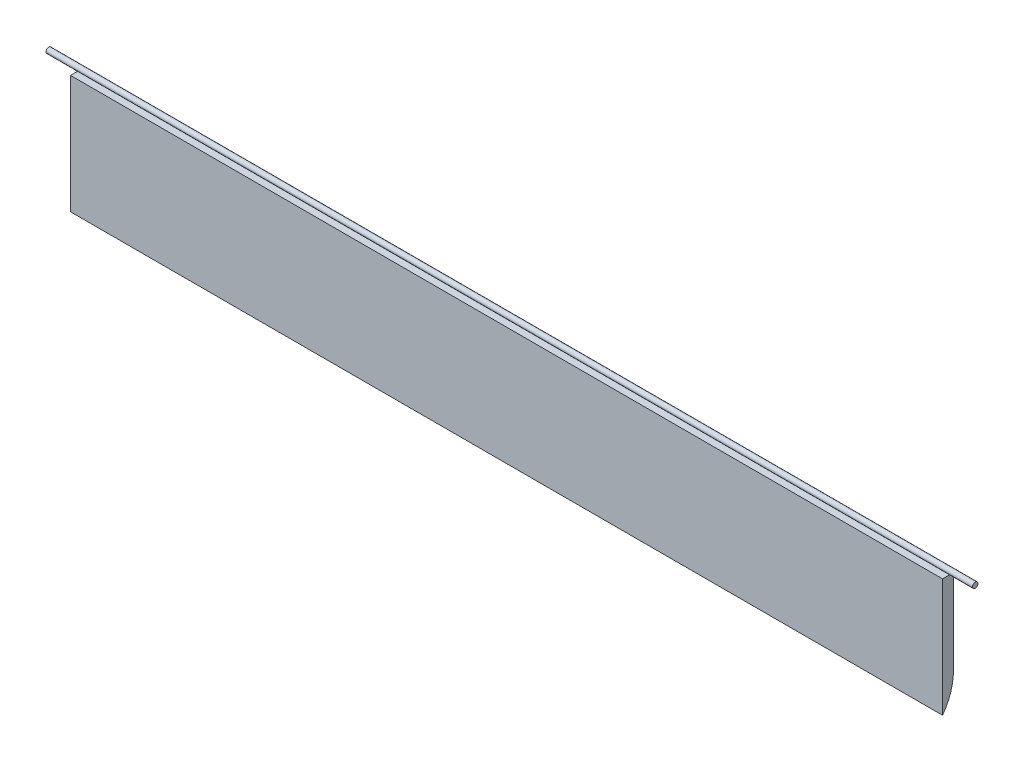
ISO-10303-21;
HEADER;
FILE_DESCRIPTION(('STEP AP214'),'2;1');
FILE_NAME('part.step','',(''),(''),'','','');
FILE_SCHEMA(('AUTOMOTIVE_DESIGN { 1 0 10303 214 1 1 1 1 }'));
ENDSEC;
DATA;
#1=APPLICATION_CONTEXT('core data for automotive mechanical design processes');
#2=APPLICATION_PROTOCOL_DEFINITION('international standard','automotive_design',2000,#1);
#3=PRODUCT_CONTEXT('',#1,'mechanical');
#4=PRODUCT('Part','Part','',(#3));
#5=PRODUCT_RELATED_PRODUCT_CATEGORY('part','',(#4));
#6=PRODUCT_DEFINITION_FORMATION('','',#4);
#7=PRODUCT_DEFINITION_CONTEXT('part definition',#1,'design');
#8=PRODUCT_DEFINITION('design','',#6,#7);
#9=PRODUCT_DEFINITION_SHAPE('','',#8);
#10=(LENGTH_UNIT() NAMED_UNIT(*) SI_UNIT(.MILLI.,.METRE.));
#11=(NAMED_UNIT(*) PLANE_ANGLE_UNIT() SI_UNIT($,.RADIAN.));
#12=(NAMED_UNIT(*) SI_UNIT($,.STERADIAN.) SOLID_ANGLE_UNIT());
#13=UNCERTAINTY_MEASURE_WITH_UNIT(LENGTH_MEASURE(1.E-05),#10,'distance_accuracy_value','');
#14=(GEOMETRIC_REPRESENTATION_CONTEXT(3) GLOBAL_UNCERTAINTY_ASSIGNED_CONTEXT((#13)) GLOBAL_UNIT_ASSIGNED_CONTEXT((#10,
#11,#12)) REPRESENTATION_CONTEXT('',''));
#15=CARTESIAN_POINT('',(0.,0.,0.));
#16=DIRECTION('',(0.,0.,1.));
#17=DIRECTION('',(1.,0.,0.));
#18=AXIS2_PLACEMENT_3D('',#15,#16,#17);
#19=CARTESIAN_POINT('',(40.,6.98,1.));
#20=DIRECTION('',(-1.,0.,0.));
#21=DIRECTION('',(0.,0.,1.));
#22=AXIS2_PLACEMENT_3D('',#19,#20,#21);
#23=PLANE('',#22);
#24=DIRECTION('',(0.,0.,-1.));
#25=VECTOR('',#24,1.);
#26=CARTESIAN_POINT('',(40.,5.98,1.));
#27=LINE('',#26,#25);
#28=CARTESIAN_POINT('',(40.,5.98,1.));
#29=VERTEX_POINT('',#28);
#30=CARTESIAN_POINT('',(40.,5.98,0.));
#31=VERTEX_POINT('',#30);
#32=EDGE_CURVE('E12',#29,#31,#27,.T.);
#33=ORIENTED_EDGE('',*,*,#32,.F.);
#34=DIRECTION('',(0.,1.,0.));
#35=VECTOR('',#34,1.);
#36=CARTESIAN_POINT('',(40.,6.98,1.));
#37=LINE('',#36,#35);
#38=CARTESIAN_POINT('',(40.,-4.85947216639639,1.));
#39=VERTEX_POINT('',#38);
#40=EDGE_CURVE('E135',#39,#29,#37,.T.);
#41=ORIENTED_EDGE('',*,*,#40,.F.);
#42=CARTESIAN_POINT('',(40.,-1.80008981549426,5.17991018450574));
#43=DIRECTION('',(-1.,0.,0.));
#44=DIRECTION('',(0.,0.,1.));
#45=AXIS2_PLACEMENT_3D('',#42,#43,#44);
#46=CIRCLE('',#45,5.17991018450574);
#47=CARTESIAN_POINT('',(40.,-1.80008981549426,0.));
#48=VERTEX_POINT('',#47);
#49=EDGE_CURVE('E159',#48,#39,#46,.T.);
#50=ORIENTED_EDGE('',*,*,#49,.F.);
#51=DIRECTION('',(0.,1.,0.));
#52=VECTOR('',#51,1.);
#53=CARTESIAN_POINT('',(40.,6.98,0.));
#54=LINE('',#53,#52);
#55=EDGE_CURVE('E148',#48,#31,#54,.T.);
#56=ORIENTED_EDGE('',*,*,#55,.T.);
#57=EDGE_LOOP('',(#33,#41,#50,#56));
#58=FACE_BOUND('',#57,.T.);
#59=ADVANCED_FACE('F45',(#58),#23,.F.);
#60=CARTESIAN_POINT('',(-40.,6.98,1.));
#61=DIRECTION('',(1.,0.,0.));
#62=DIRECTION('',(0.,0.,-1.));
#63=AXIS2_PLACEMENT_3D('',#60,#61,#62);
#64=PLANE('',#63);
#65=DIRECTION('',(0.,0.,1.));
#66=VECTOR('',#65,1.);
#67=CARTESIAN_POINT('',(-40.,5.98,0.));
#68=LINE('',#67,#66);
#69=CARTESIAN_POINT('',(-40.,5.98,0.));
#70=VERTEX_POINT('',#69);
#71=CARTESIAN_POINT('',(-40.,5.98,1.));
#72=VERTEX_POINT('',#71);
#73=EDGE_CURVE('E128',#70,#72,#68,.T.);
#74=ORIENTED_EDGE('',*,*,#73,.F.);
#75=DIRECTION('',(0.,-1.,0.));
#76=VECTOR('',#75,1.);
#77=CARTESIAN_POINT('',(-40.,6.98,0.));
#78=LINE('',#77,#76);
#79=CARTESIAN_POINT('',(-40.,-1.80008981549426,0.));
#80=VERTEX_POINT('',#79);
#81=EDGE_CURVE('E140',#70,#80,#78,.T.);
#82=ORIENTED_EDGE('',*,*,#81,.T.);
#83=CARTESIAN_POINT('',(-40.,-1.80008981549426,5.17991018450574));
#84=DIRECTION('',(1.,0.,0.));
#85=DIRECTION('',(0.,0.,-1.));
#86=AXIS2_PLACEMENT_3D('',#83,#84,#85);
#87=CIRCLE('',#86,5.17991018450574);
#88=CARTESIAN_POINT('',(-40.,-4.85947216639639,1.));
#89=VERTEX_POINT('',#88);
#90=EDGE_CURVE('E160',#89,#80,#87,.T.);
#91=ORIENTED_EDGE('',*,*,#90,.F.);
#92=DIRECTION('',(0.,-1.,0.));
#93=VECTOR('',#92,1.);
#94=CARTESIAN_POINT('',(-40.,6.98,1.));
#95=LINE('',#94,#93);
#96=EDGE_CURVE('E142',#72,#89,#95,.T.);
#97=ORIENTED_EDGE('',*,*,#96,.F.);
#98=EDGE_LOOP('',(#74,#82,#91,#97));
#99=FACE_BOUND('',#98,.T.);
#100=ADVANCED_FACE('F138',(#99),#64,.F.);
#101=CARTESIAN_POINT('',(0.,0.,1.));
#102=DIRECTION('',(0.,0.,1.));
#103=DIRECTION('',(1.,0.,0.));
#104=AXIS2_PLACEMENT_3D('',#101,#102,#103);
#105=PLANE('',#104);
#106=DIRECTION('',(1.,0.,0.));
#107=VECTOR('',#106,1.);
#108=CARTESIAN_POINT('',(-42.6642135623731,5.98,1.));
#109=LINE('',#108,#107);
#110=EDGE_CURVE('E55',#72,#29,#109,.T.);
#111=ORIENTED_EDGE('',*,*,#110,.F.);
#112=ORIENTED_EDGE('',*,*,#96,.T.);
#113=DIRECTION('',(1.,0.,0.));
#114=VECTOR('',#113,1.);
#115=CARTESIAN_POINT('',(-47.3254992348025,-4.85947216639639,1.));
#116=LINE('',#115,#114);
#117=CARTESIAN_POINT('',(-1.49999999999999,-4.85947216639639,1.));
#118=VERTEX_POINT('',#117);
#119=EDGE_CURVE('E157',#118,#89,#116,.F.);
#120=ORIENTED_EDGE('',*,*,#119,.F.);
#121=DIRECTION('',(1.,0.,0.));
#122=VECTOR('',#121,1.);
#123=CARTESIAN_POINT('',(-47.3254992348025,-4.85947216639639,0.999999999999999));
#124=LINE('',#123,#122);
#125=CARTESIAN_POINT('',(1.5,-4.85947216639639,1.));
#126=VERTEX_POINT('',#125);
#127=EDGE_CURVE('E164',#126,#118,#124,.F.);
#128=ORIENTED_EDGE('',*,*,#127,.F.);
#129=EDGE_CURVE('E134',#39,#126,#116,.F.);
#130=ORIENTED_EDGE('',*,*,#129,.F.);
#131=ORIENTED_EDGE('',*,*,#40,.T.);
#132=EDGE_LOOP('',(#111,#112,#120,#128,#130,#131));
#133=FACE_BOUND('',#132,.T.);
#134=ADVANCED_FACE('F266',(#133),#105,.T.);
#135=CARTESIAN_POINT('',(0.,0.,0.));
#136=DIRECTION('',(0.,0.,1.));
#137=DIRECTION('',(1.,0.,0.));
#138=AXIS2_PLACEMENT_3D('',#135,#136,#137);
#139=PLANE('',#138);
#140=ORIENTED_EDGE('',*,*,#81,.F.);
#141=DIRECTION('',(1.,0.,0.));
#142=VECTOR('',#141,1.);
#143=CARTESIAN_POINT('',(-42.6642135623731,5.98,0.));
#144=LINE('',#143,#142);
#145=EDGE_CURVE('E49',#70,#31,#144,.T.);
#146=ORIENTED_EDGE('',*,*,#145,.T.);
#147=ORIENTED_EDGE('',*,*,#55,.F.);
#148=DIRECTION('',(1.,0.,0.));
#149=VECTOR('',#148,1.);
#150=CARTESIAN_POINT('',(-47.3254992348025,-1.80008981549426,0.));
#151=LINE('',#150,#149);
#152=EDGE_CURVE('E147',#80,#48,#151,.T.);
#153=ORIENTED_EDGE('',*,*,#152,.F.);
#154=EDGE_LOOP('',(#140,#146,#147,#153));
#155=FACE_BOUND('',#154,.T.);
#156=ADVANCED_FACE('F146',(#155),#139,.F.);
#157=CARTESIAN_POINT('',(-47.3254992348025,-1.80008981549426,5.17991018450574));
#158=DIRECTION('',(1.,0.,0.));
#159=DIRECTION('',(0.,0.,-1.));
#160=AXIS2_PLACEMENT_3D('',#157,#158,#159);
#161=CYLINDRICAL_SURFACE('',#160,5.17991018450574);
#162=ORIENTED_EDGE('',*,*,#129,.T.);
#163=CARTESIAN_POINT('',(2.5,-3.85947216639639,0.426972792498655));
#164=CARTESIAN_POINT('',(2.49999847395554,-3.89082414948654,0.440555080662323));
#165=CARTESIAN_POINT('',(2.49852526721426,-3.92202008218584,0.454442784242701));
#166=CARTESIAN_POINT('',(2.49271552225159,-3.98390050023184,0.482720160249902));
#167=CARTESIAN_POINT('',(2.48838006527039,-4.01458517422518,0.497109641182465));
#168=CARTESIAN_POINT('',(2.47122357773737,-4.10547640664829,0.540819626477462));
#169=CARTESIAN_POINT('',(2.45425170373229,-4.16465870301534,0.570741887988181));
#170=CARTESIAN_POINT('',(2.40997024777226,-4.27863119964961,0.631013131109536));
#171=CARTESIAN_POINT('',(2.38267274394256,-4.33342644116542,0.661361574422132));
#172=CARTESIAN_POINT('',(2.31829025527069,-4.43752781267861,0.721322955331403));
#173=CARTESIAN_POINT('',(2.28119345814009,-4.48682721518788,0.750934957750551));
#174=CARTESIAN_POINT('',(2.19698569668032,-4.57933195298483,0.808377086141662));
#175=CARTESIAN_POINT('',(2.14970384073762,-4.6224092061392,0.836164668570087));
#176=CARTESIAN_POINT('',(2.04624195320722,-4.69956779653423,0.887284187296948));
#177=CARTESIAN_POINT('',(1.99008126716932,-4.73366827191189,0.910625572838732));
#178=CARTESIAN_POINT('',(1.88777698877754,-4.78242321932396,0.944609896364497));
#179=CARTESIAN_POINT('',(1.84351214268714,-4.7998480528797,0.956969967097533));
#180=CARTESIAN_POINT('',(1.75208256572766,-4.82835451233032,0.977364210211646));
#181=CARTESIAN_POINT('',(1.70492484681205,-4.83945085336247,0.985408415324489));
#182=CARTESIAN_POINT('',(1.63113339557833,-4.85118348417952,0.993942964401292));
#183=CARTESIAN_POINT('',(1.60506751195078,-4.85428372479923,0.996206119178754));
#184=CARTESIAN_POINT('',(1.55267329993292,-4.85843036338746,0.999237370263221));
#185=CARTESIAN_POINT('',(1.52634483967273,-4.85947567110694,1.00000467294089));
#186=CARTESIAN_POINT('',(1.49999999999999,-4.85947216639639,0.999999999999999));
#187=B_SPLINE_CURVE_WITH_KNOTS('',3,(#163,#164,#165,#166,#167,#168,#169,#170,#171,#172,#173,
#174,#175,#176,#177,#178,#179,#180,#181,#182,#183,#184,#185,#186),.UNSPECIFIED.,.F.,.F.,(4,2,2,
2,2,2,2,2,2,2,2,4),(0.,0.102429546085473,0.204820420632754,0.409154915949141,0.613251131969499,
0.817594501816002,1.02567867022431,1.23331555113827,1.38018366794735,1.52670887698663,
1.60563875554236,1.68461049922488),.UNSPECIFIED.);
#188=CARTESIAN_POINT('',(2.5,-3.85947216639639,0.426972792498655));
#189=VERTEX_POINT('',#188);
#190=EDGE_CURVE('E183',#189,#126,#187,.T.);
#191=ORIENTED_EDGE('',*,*,#190,.F.);
#192=CARTESIAN_POINT('',(2.4999999999999,-1.80008981549426,5.17991018450574));
#193=DIRECTION('',(1.,0.,0.));
#194=DIRECTION('',(0.,1.,0.));
#195=AXIS2_PLACEMENT_3D('',#192,#193,#194);
#196=CIRCLE('',#195,5.17991018450574);
#197=CARTESIAN_POINT('',(2.5,-3.84065195895772,0.418862436560956));
#198=VERTEX_POINT('',#197);
#199=EDGE_CURVE('E180',#198,#189,#196,.F.);
#200=ORIENTED_EDGE('',*,*,#199,.F.);
#201=CARTESIAN_POINT('',(1.5,-2.84065195895772,0.105592501788484));
#202=CARTESIAN_POINT('',(1.52758834808474,-2.8406518816412,0.105593784988159));
#203=CARTESIAN_POINT('',(1.55516346635173,-2.84179439058306,0.105826628113255));
#204=CARTESIAN_POINT('',(1.61011589020866,-2.84635054365295,0.106763627605295));
#205=CARTESIAN_POINT('',(1.63749320601662,-2.84976406960527,0.107467759448047));
#206=CARTESIAN_POINT('',(1.71897600636639,-2.86337363662664,0.110295950056698));
#207=CARTESIAN_POINT('',(1.77253478651727,-2.87693878430165,0.113135751642663));
#208=CARTESIAN_POINT('',(1.87656257814398,-2.91262714547151,0.120853011570204));
#209=CARTESIAN_POINT('',(1.92703011600464,-2.93475440436443,0.125731433199493));
#210=CARTESIAN_POINT('',(2.02345627894774,-2.98684055647205,0.137707953233873));
#211=CARTESIAN_POINT('',(2.06941554887571,-3.01679832738702,0.144805733580341));
#212=CARTESIAN_POINT('',(2.15565820646305,-3.08362156254717,0.16142439542729));
#213=CARTESIAN_POINT('',(2.19592935031509,-3.12050154151606,0.170950383786315));
#214=CARTESIAN_POINT('',(2.26964893956613,-3.19989081563004,0.192554623904934));
#215=CARTESIAN_POINT('',(2.3030975628162,-3.24239996398498,0.204632809116553));
#216=CARTESIAN_POINT('',(2.36287990839942,-3.33232375726092,0.231581062511553));
#217=CARTESIAN_POINT('',(2.38909950004322,-3.37980236695272,0.246490255801067));
#218=CARTESIAN_POINT('',(2.43333070457558,-3.47763981929146,0.278894759123955));
#219=CARTESIAN_POINT('',(2.45133785133937,-3.5280002124078,0.29639146947877));
#220=CARTESIAN_POINT('',(2.47688068214599,-3.62223033959145,0.330850188431054));
#221=CARTESIAN_POINT('',(2.48560057995484,-3.66590772511487,0.347480901312472));
#222=CARTESIAN_POINT('',(2.4971604102399,-3.75336787623258,0.382158582133525));
#223=CARTESIAN_POINT('',(2.5000133703167,-3.79715019174932,0.400202319673841));
#224=CARTESIAN_POINT('',(2.5,-3.84065195895772,0.418862436560955));
#225=B_SPLINE_CURVE_WITH_KNOTS('',3,(#201,#202,#203,#204,#205,#206,#207,#208,#209,#210,#211,
#212,#213,#214,#215,#216,#217,#218,#219,#220,#221,#222,#223,#224),.UNSPECIFIED.,.F.,.F.,(4,2,2,
2,2,2,2,2,2,2,2,4),(0.,0.0827141375944008,0.165423971373554,0.330540229662502,0.495734596981804,
0.660905300965441,0.826426290002397,0.991942963648166,1.15993996588603,1.32802822030561,
1.47027636502555,1.61220830358898),.UNSPECIFIED.);
#226=CARTESIAN_POINT('',(1.5,-2.84065195895772,0.105592501788484));
#227=VERTEX_POINT('',#226);
#228=EDGE_CURVE('E177',#227,#198,#225,.T.);
#229=ORIENTED_EDGE('',*,*,#228,.F.);
#230=DIRECTION('',(1.,0.,0.));
#231=VECTOR('',#230,1.);
#232=CARTESIAN_POINT('',(-47.3254992348025,-2.84065195895772,0.105592501788484));
#233=LINE('',#232,#231);
#234=CARTESIAN_POINT('',(-1.5,-2.84065195895772,0.105592501788484));
#235=VERTEX_POINT('',#234);
#236=EDGE_CURVE('E162',#235,#227,#233,.T.);
#237=ORIENTED_EDGE('',*,*,#236,.F.);
#238=CARTESIAN_POINT('',(-2.5,-3.84065195895772,0.418862436560956));
#239=CARTESIAN_POINT('',(-2.49999886221525,-3.81260797509022,0.406841564262529));
#240=CARTESIAN_POINT('',(-2.49881934208475,-3.7844664185948,0.395075301465987));
#241=CARTESIAN_POINT('',(-2.494053786667,-3.72814637894068,0.372104930717622));
#242=CARTESIAN_POINT('',(-2.49046686755148,-3.69996788601486,0.360901030850297));
#243=CARTESIAN_POINT('',(-2.47601146422054,-3.61558642680814,0.328202401986494));
#244=CARTESIAN_POINT('',(-2.46144812305689,-3.55959727330936,0.307646311743904));
#245=CARTESIAN_POINT('',(-2.42237370428385,-3.44998098686308,0.269440332524655));
#246=CARTESIAN_POINT('',(-2.39783689024922,-3.39636036579741,0.251798129705753));
#247=CARTESIAN_POINT('',(-2.33920653986099,-3.29364130500504,0.219701963083331));
#248=CARTESIAN_POINT('',(-2.30512607689016,-3.24453680025658,0.205243685836972));
#249=CARTESIAN_POINT('',(-2.23038623479794,-3.1552786737386,0.180213380555932));
#250=CARTESIAN_POINT('',(-2.19019543128395,-3.11478005047753,0.169470538268893));
#251=CARTESIAN_POINT('',(-2.10311124319792,-3.04095582743826,0.15067800594746));
#252=CARTESIAN_POINT('',(-2.05621587084162,-3.0076323623347,0.142629116994836));
#253=CARTESIAN_POINT('',(-1.95895224934175,-2.95046587553396,0.12927279333274));
#254=CARTESIAN_POINT('',(-1.90877243542221,-2.92632203268605,0.123876269200102));
#255=CARTESIAN_POINT('',(-1.80496091380625,-2.88667122693374,0.115206284967269));
#256=CARTESIAN_POINT('',(-1.75133228867984,-2.87115666759911,0.111930957141384));
#257=CARTESIAN_POINT('',(-1.66440699995871,-2.85370481231508,0.108282506396641));
#258=CARTESIAN_POINT('',(-1.63170048396353,-2.84881229537321,0.107270928182851));
#259=CARTESIAN_POINT('',(-1.56600093178388,-2.84228707243411,0.105927699842739));
#260=CARTESIAN_POINT('',(-1.53300841384893,-2.84064936260985,0.105595006002147));
#261=CARTESIAN_POINT('',(-1.5,-2.84065195895772,0.105592501788484));
#262=B_SPLINE_CURVE_WITH_KNOTS('',3,(#238,#239,#240,#241,#242,#243,#244,#245,#246,#247,#248,
#249,#250,#251,#252,#253,#254,#255,#256,#257,#258,#259,#260,#261),.UNSPECIFIED.,.F.,.F.,(4,2,2,
2,2,2,2,2,2,2,2,4),(0.,0.0914876166787981,0.183008839587503,0.366244028977571,0.549955087111085,
0.733415709150117,0.906721379459776,1.08007853875454,1.2471283166323,1.41403080550667,
1.51313498307441,1.61208668311105),.UNSPECIFIED.);
#263=CARTESIAN_POINT('',(-2.5,-3.84065195895772,0.418862436560956));
#264=VERTEX_POINT('',#263);
#265=EDGE_CURVE('E175',#264,#235,#262,.T.);
#266=ORIENTED_EDGE('',*,*,#265,.F.);
#267=CARTESIAN_POINT('',(-2.4999999999999,-1.80008981549426,5.17991018450574));
#268=DIRECTION('',(-1.,0.,0.));
#269=DIRECTION('',(0.,-1.,0.));
#270=AXIS2_PLACEMENT_3D('',#267,#268,#269);
#271=CIRCLE('',#270,5.17991018450574);
#272=CARTESIAN_POINT('',(-2.5,-3.85947216639639,0.426972792498658));
#273=VERTEX_POINT('',#272);
#274=EDGE_CURVE('E189',#273,#264,#271,.F.);
#275=ORIENTED_EDGE('',*,*,#274,.F.);
#276=CARTESIAN_POINT('',(-1.49999999999999,-4.85947216639639,0.999999999999999));
#277=CARTESIAN_POINT('',(-1.52468311623632,-4.85947453492043,1.00000326727792));
#278=CARTESIAN_POINT('',(-1.54935201562722,-4.85855758685037,0.999330464688924));
#279=CARTESIAN_POINT('',(-1.59846948588445,-4.85491646608483,0.996668445604831));
#280=CARTESIAN_POINT('',(-1.62291818451494,-4.85219342035385,0.994680050012216));
#281=CARTESIAN_POINT('',(-1.69533284659978,-4.84141402578081,0.98683270941161));
#282=CARTESIAN_POINT('',(-1.74273856095532,-4.83074634555757,0.979090471986977));
#283=CARTESIAN_POINT('',(-1.83452504063355,-4.80307832687797,0.959268882635367));
#284=CARTESIAN_POINT('',(-1.878912044392,-4.78609154881117,0.947198819941162));
#285=CARTESIAN_POINT('',(-1.9640184122557,-4.7465419118141,0.919573236811169));
#286=CARTESIAN_POINT('',(-2.00473181294351,-4.72397020136459,0.904012187224351));
#287=CARTESIAN_POINT('',(-2.08528484486709,-4.67184029941482,0.868809440562148));
#288=CARTESIAN_POINT('',(-2.12473388769894,-4.64184268966745,0.84892941719478));
#289=CARTESIAN_POINT('',(-2.19820142243285,-4.57704903139964,0.807101401421211));
#290=CARTESIAN_POINT('',(-2.23221773854853,-4.54225107070349,0.7851525860398));
#291=CARTESIAN_POINT('',(-2.30018948903493,-4.46191840502313,0.735955763060613));
#292=CARTESIAN_POINT('',(-2.33302374953567,-4.41557972934896,0.708466758800821));
#293=CARTESIAN_POINT('',(-2.39032644689934,-4.31828534285047,0.652956426459427));
#294=CARTESIAN_POINT('',(-2.41479234980576,-4.26732823945444,0.624934939847432));
#295=CARTESIAN_POINT('',(-2.45610825092582,-4.15854067152707,0.567627941000237));
#296=CARTESIAN_POINT('',(-2.47239772881953,-4.10048025031909,0.538370594557711));
#297=CARTESIAN_POINT('',(-2.49435064333044,-3.98164565188527,0.481319373544611));
#298=CARTESIAN_POINT('',(-2.5000053850549,-3.92086929565004,0.453526714520425));
#299=CARTESIAN_POINT('',(-2.5,-3.85947216639639,0.426972792498658));
#300=B_SPLINE_CURVE_WITH_KNOTS('',3,(#276,#277,#278,#279,#280,#281,#282,#283,#284,#285,#286,
#287,#288,#289,#290,#291,#292,#293,#294,#295,#296,#297,#298,#299),.UNSPECIFIED.,.F.,.F.,(4,2,2,
2,2,2,2,2,2,2,2,4),(0.,0.073996074061842,0.147946019612632,0.294748710166597,0.441238171727759,
0.587961307459206,0.747567070161457,0.907236594933069,1.09575135983784,1.28432315698531,
1.48448512686888,1.68481067688283),.UNSPECIFIED.);
#301=EDGE_CURVE('E186',#118,#273,#300,.T.);
#302=ORIENTED_EDGE('',*,*,#301,.F.);
#303=ORIENTED_EDGE('',*,*,#119,.T.);
#304=ORIENTED_EDGE('',*,*,#90,.T.);
#305=ORIENTED_EDGE('',*,*,#152,.T.);
#306=ORIENTED_EDGE('',*,*,#49,.T.);
#307=EDGE_LOOP('',(#162,#191,#200,#229,#237,#266,#275,#302,#303,#304,#305,#306));
#308=FACE_BOUND('',#307,.T.);
#309=ADVANCED_FACE('F236',(#308),#161,.T.);
#310=CARTESIAN_POINT('',(1.5,-2.84065195895772,1.001));
#311=DIRECTION('',(0.,1.,0.));
#312=DIRECTION('',(0.,0.,1.));
#313=AXIS2_PLACEMENT_3D('',#310,#311,#312);
#314=PLANE('',#313);
#315=DIRECTION('',(0.,0.,-1.));
#316=VECTOR('',#315,1.);
#317=CARTESIAN_POINT('',(-1.5,-2.84065195895772,1.001));
#318=LINE('',#317,#316);
#319=CARTESIAN_POINT('',(-1.5,-2.84065195895772,-2.));
#320=VERTEX_POINT('',#319);
#321=EDGE_CURVE('E172',#235,#320,#318,.T.);
#322=ORIENTED_EDGE('',*,*,#321,.F.);
#323=ORIENTED_EDGE('',*,*,#236,.T.);
#324=DIRECTION('',(0.,0.,-1.));
#325=VECTOR('',#324,1.);
#326=CARTESIAN_POINT('',(1.5,-2.84065195895772,1.001));
#327=LINE('',#326,#325);
#328=CARTESIAN_POINT('',(1.5,-2.84065195895772,-2.));
#329=VERTEX_POINT('',#328);
#330=EDGE_CURVE('E171',#227,#329,#327,.T.);
#331=ORIENTED_EDGE('',*,*,#330,.T.);
#332=DIRECTION('',(1.,0.,0.));
#333=VECTOR('',#332,1.);
#334=CARTESIAN_POINT('',(1.5,-2.84065195895772,-2.));
#335=LINE('',#334,#333);
#336=EDGE_CURVE('E281',#320,#329,#335,.T.);
#337=ORIENTED_EDGE('',*,*,#336,.F.);
#338=EDGE_LOOP('',(#322,#323,#331,#337));
#339=FACE_BOUND('',#338,.T.);
#340=ADVANCED_FACE('F238',(#339),#314,.T.);
#341=CARTESIAN_POINT('',(1.5,-3.84065195895772,1.001));
#342=DIRECTION('',(0.,0.,-1.));
#343=DIRECTION('',(-1.,0.,0.));
#344=AXIS2_PLACEMENT_3D('',#341,#342,#343);
#345=CYLINDRICAL_SURFACE('',#344,1.);
#346=ORIENTED_EDGE('',*,*,#330,.F.);
#347=ORIENTED_EDGE('',*,*,#228,.T.);
#348=DIRECTION('',(0.,0.,-1.));
#349=VECTOR('',#348,1.);
#350=CARTESIAN_POINT('',(2.5,-3.84065195895772,1.001));
#351=LINE('',#350,#349);
#352=CARTESIAN_POINT('',(2.5,-3.84065195895772,-2.));
#353=VERTEX_POINT('',#352);
#354=EDGE_CURVE('E178',#198,#353,#351,.T.);
#355=ORIENTED_EDGE('',*,*,#354,.T.);
#356=CARTESIAN_POINT('',(1.5,-3.84065195895772,-2.));
#357=DIRECTION('',(0.,0.,-1.));
#358=DIRECTION('',(-1.,0.,0.));
#359=AXIS2_PLACEMENT_3D('',#356,#357,#358);
#360=CIRCLE('',#359,1.);
#361=EDGE_CURVE('E284',#329,#353,#360,.T.);
#362=ORIENTED_EDGE('',*,*,#361,.F.);
#363=EDGE_LOOP('',(#346,#347,#355,#362));
#364=FACE_BOUND('',#363,.T.);
#365=ADVANCED_FACE('F240',(#364),#345,.T.);
#366=CARTESIAN_POINT('',(2.5,-3.84065195895772,1.001));
#367=DIRECTION('',(1.,0.,0.));
#368=DIRECTION('',(0.,1.,0.));
#369=AXIS2_PLACEMENT_3D('',#366,#367,#368);
#370=PLANE('',#369);
#371=ORIENTED_EDGE('',*,*,#354,.F.);
#372=ORIENTED_EDGE('',*,*,#199,.T.);
#373=DIRECTION('',(0.,0.,-1.));
#374=VECTOR('',#373,1.);
#375=CARTESIAN_POINT('',(2.5,-3.85947216639639,1.001));
#376=LINE('',#375,#374);
#377=CARTESIAN_POINT('',(2.5,-3.85947216639639,-2.));
#378=VERTEX_POINT('',#377);
#379=EDGE_CURVE('E181',#189,#378,#376,.T.);
#380=ORIENTED_EDGE('',*,*,#379,.T.);
#381=DIRECTION('',(0.,-1.,0.));
#382=VECTOR('',#381,1.);
#383=CARTESIAN_POINT('',(2.5,-3.84065195895772,-2.));
#384=LINE('',#383,#382);
#385=EDGE_CURVE('E287',#353,#378,#384,.T.);
#386=ORIENTED_EDGE('',*,*,#385,.F.);
#387=EDGE_LOOP('',(#371,#372,#380,#386));
#388=FACE_BOUND('',#387,.T.);
#389=ADVANCED_FACE('F245',(#388),#370,.T.);
#390=CARTESIAN_POINT('',(1.5,-3.85947216639639,1.001));
#391=DIRECTION('',(0.,0.,-1.));
#392=DIRECTION('',(-1.,0.,0.));
#393=AXIS2_PLACEMENT_3D('',#390,#391,#392);
#394=CYLINDRICAL_SURFACE('',#393,1.);
#395=ORIENTED_EDGE('',*,*,#379,.F.);
#396=ORIENTED_EDGE('',*,*,#190,.T.);
#397=DIRECTION('',(0.,0.,-1.));
#398=VECTOR('',#397,1.);
#399=CARTESIAN_POINT('',(1.49999999999999,-4.85947216639639,1.001));
#400=LINE('',#399,#398);
#401=CARTESIAN_POINT('',(1.49999999999999,-4.85947216639639,-2.));
#402=VERTEX_POINT('',#401);
#403=EDGE_CURVE('E168',#126,#402,#400,.T.);
#404=ORIENTED_EDGE('',*,*,#403,.T.);
#405=CARTESIAN_POINT('',(1.5,-3.85947216639639,-2.));
#406=DIRECTION('',(0.,0.,-1.));
#407=DIRECTION('',(-1.,0.,0.));
#408=AXIS2_PLACEMENT_3D('',#405,#406,#407);
#409=CIRCLE('',#408,1.);
#410=EDGE_CURVE('E290',#378,#402,#409,.T.);
#411=ORIENTED_EDGE('',*,*,#410,.F.);
#412=EDGE_LOOP('',(#395,#396,#404,#411));
#413=FACE_BOUND('',#412,.T.);
#414=ADVANCED_FACE('F248',(#413),#394,.T.);
#415=CARTESIAN_POINT('',(1.49999999999999,-4.85947216639639,1.001));
#416=DIRECTION('',(0.,-1.,0.));
#417=DIRECTION('',(0.,0.,-1.));
#418=AXIS2_PLACEMENT_3D('',#415,#416,#417);
#419=PLANE('',#418);
#420=ORIENTED_EDGE('',*,*,#403,.F.);
#421=ORIENTED_EDGE('',*,*,#127,.T.);
#422=DIRECTION('',(0.,0.,-1.));
#423=VECTOR('',#422,1.);
#424=CARTESIAN_POINT('',(-1.49999999999999,-4.85947216639639,1.001));
#425=LINE('',#424,#423);
#426=CARTESIAN_POINT('',(-1.49999999999999,-4.85947216639639,-2.));
#427=VERTEX_POINT('',#426);
#428=EDGE_CURVE('E167',#118,#427,#425,.T.);
#429=ORIENTED_EDGE('',*,*,#428,.T.);
#430=DIRECTION('',(-1.,0.,0.));
#431=VECTOR('',#430,1.);
#432=CARTESIAN_POINT('',(1.49999999999999,-4.85947216639639,-2.));
#433=LINE('',#432,#431);
#434=EDGE_CURVE('E293',#402,#427,#433,.T.);
#435=ORIENTED_EDGE('',*,*,#434,.F.);
#436=EDGE_LOOP('',(#420,#421,#429,#435));
#437=FACE_BOUND('',#436,.T.);
#438=ADVANCED_FACE('F252',(#437),#419,.T.);
#439=CARTESIAN_POINT('',(-1.5,-3.85947216639639,1.001));
#440=DIRECTION('',(0.,0.,-1.));
#441=DIRECTION('',(-1.,0.,0.));
#442=AXIS2_PLACEMENT_3D('',#439,#440,#441);
#443=CYLINDRICAL_SURFACE('',#442,1.);
#444=ORIENTED_EDGE('',*,*,#428,.F.);
#445=ORIENTED_EDGE('',*,*,#301,.T.);
#446=DIRECTION('',(0.,0.,-1.));
#447=VECTOR('',#446,1.);
#448=CARTESIAN_POINT('',(-2.5,-3.85947216639639,1.001));
#449=LINE('',#448,#447);
#450=CARTESIAN_POINT('',(-2.5,-3.85947216639639,-2.));
#451=VERTEX_POINT('',#450);
#452=EDGE_CURVE('E187',#273,#451,#449,.T.);
#453=ORIENTED_EDGE('',*,*,#452,.T.);
#454=CARTESIAN_POINT('',(-1.5,-3.85947216639639,-2.));
#455=DIRECTION('',(0.,0.,-1.));
#456=DIRECTION('',(-1.,0.,0.));
#457=AXIS2_PLACEMENT_3D('',#454,#455,#456);
#458=CIRCLE('',#457,1.);
#459=EDGE_CURVE('E296',#427,#451,#458,.T.);
#460=ORIENTED_EDGE('',*,*,#459,.F.);
#461=EDGE_LOOP('',(#444,#445,#453,#460));
#462=FACE_BOUND('',#461,.T.);
#463=ADVANCED_FACE('F201',(#462),#443,.T.);
#464=CARTESIAN_POINT('',(-2.5,-3.84065195895772,1.001));
#465=DIRECTION('',(-1.,0.,0.));
#466=DIRECTION('',(0.,-1.,0.));
#467=AXIS2_PLACEMENT_3D('',#464,#465,#466);
#468=PLANE('',#467);
#469=ORIENTED_EDGE('',*,*,#452,.F.);
#470=ORIENTED_EDGE('',*,*,#274,.T.);
#471=DIRECTION('',(0.,0.,-1.));
#472=VECTOR('',#471,1.);
#473=CARTESIAN_POINT('',(-2.5,-3.84065195895772,1.001));
#474=LINE('',#473,#472);
#475=CARTESIAN_POINT('',(-2.5,-3.84065195895772,-2.));
#476=VERTEX_POINT('',#475);
#477=EDGE_CURVE('E190',#264,#476,#474,.T.);
#478=ORIENTED_EDGE('',*,*,#477,.T.);
#479=DIRECTION('',(0.,1.,0.));
#480=VECTOR('',#479,1.);
#481=CARTESIAN_POINT('',(-2.5,-3.84065195895772,-2.));
#482=LINE('',#481,#480);
#483=EDGE_CURVE('E143',#451,#476,#482,.T.);
#484=ORIENTED_EDGE('',*,*,#483,.F.);
#485=EDGE_LOOP('',(#469,#470,#478,#484));
#486=FACE_BOUND('',#485,.T.);
#487=ADVANCED_FACE('F206',(#486),#468,.T.);
#488=CARTESIAN_POINT('',(-1.5,-3.84065195895772,1.001));
#489=DIRECTION('',(0.,0.,-1.));
#490=DIRECTION('',(-1.,0.,0.));
#491=AXIS2_PLACEMENT_3D('',#488,#489,#490);
#492=CYLINDRICAL_SURFACE('',#491,1.);
#493=ORIENTED_EDGE('',*,*,#477,.F.);
#494=ORIENTED_EDGE('',*,*,#265,.T.);
#495=ORIENTED_EDGE('',*,*,#321,.T.);
#496=CARTESIAN_POINT('',(-1.5,-3.84065195895772,-2.));
#497=DIRECTION('',(0.,0.,-1.));
#498=DIRECTION('',(1.,0.,0.));
#499=AXIS2_PLACEMENT_3D('',#496,#497,#498);
#500=CIRCLE('',#499,1.);
#501=EDGE_CURVE('E174',#476,#320,#500,.T.);
#502=ORIENTED_EDGE('',*,*,#501,.F.);
#503=EDGE_LOOP('',(#493,#494,#495,#502));
#504=FACE_BOUND('',#503,.T.);
#505=ADVANCED_FACE('F230',(#504),#492,.T.);
#506=CARTESIAN_POINT('',(-1.5,-3.84065195895772,-2.));
#507=DIRECTION('',(0.,0.,1.));
#508=DIRECTION('',(1.,0.,0.));
#509=AXIS2_PLACEMENT_3D('',#506,#507,#508);
#510=PLANE('',#509);
#511=ORIENTED_EDGE('',*,*,#501,.T.);
#512=ORIENTED_EDGE('',*,*,#336,.T.);
#513=ORIENTED_EDGE('',*,*,#361,.T.);
#514=ORIENTED_EDGE('',*,*,#385,.T.);
#515=ORIENTED_EDGE('',*,*,#410,.T.);
#516=ORIENTED_EDGE('',*,*,#434,.T.);
#517=ORIENTED_EDGE('',*,*,#459,.T.);
#518=ORIENTED_EDGE('',*,*,#483,.T.);
#519=EDGE_LOOP('',(#511,#512,#513,#514,#515,#516,#517,#518));
#520=FACE_BOUND('',#519,.T.);
#521=ADVANCED_FACE('F207',(#520),#510,.F.);
#522=CARTESIAN_POINT('',(-42.6642135623731,5.98,0.));
#523=DIRECTION('',(0.,-1.,0.));
#524=DIRECTION('',(0.,0.,-1.));
#525=AXIS2_PLACEMENT_3D('',#522,#523,#524);
#526=PLANE('',#525);
#527=ORIENTED_EDGE('',*,*,#145,.F.);
#528=ORIENTED_EDGE('',*,*,#73,.T.);
#529=ORIENTED_EDGE('',*,*,#110,.T.);
#530=ORIENTED_EDGE('',*,*,#32,.T.);
#531=EDGE_LOOP('',(#527,#528,#529,#530));
#532=FACE_BOUND('',#531,.T.);
#533=ADVANCED_FACE('F47',(#532),#526,.F.);
#534=CLOSED_SHELL('',(#59,#100,#134,#156,#309,#340,#365,#389,#414,#438,#463,#487,#505,#521,#533));
#535=MANIFOLD_SOLID_BREP('B2',#534);
#536=CARTESIAN_POINT('',(42.5,6.48,0.5));
#537=DIRECTION('',(1.,0.,0.));
#538=DIRECTION('',(0.,0.,-1.));
#539=AXIS2_PLACEMENT_3D('',#536,#537,#538);
#540=PLANE('',#539);
#541=CARTESIAN_POINT('',(42.5,6.48,0.5));
#542=DIRECTION('',(1.,0.,0.));
#543=DIRECTION('',(0.,0.,-1.));
#544=AXIS2_PLACEMENT_3D('',#541,#542,#543);
#545=CIRCLE('',#544,0.25);
#546=CARTESIAN_POINT('',(42.5,6.48,0.25));
#547=VERTEX_POINT('',#546);
#548=EDGE_CURVE('E464',#547,#547,#545,.T.);
#549=ORIENTED_EDGE('',*,*,#548,.T.);
#550=EDGE_LOOP('',(#549));
#551=FACE_BOUND('',#550,.T.);
#552=ADVANCED_FACE('F457',(#551),#540,.T.);
#553=CARTESIAN_POINT('',(-42.5,6.48,0.5));
#554=DIRECTION('',(-1.,0.,0.));
#555=DIRECTION('',(0.,0.,1.));
#556=AXIS2_PLACEMENT_3D('',#553,#554,#555);
#557=PLANE('',#556);
#558=CARTESIAN_POINT('',(-42.5,6.48,0.5));
#559=DIRECTION('',(-1.,0.,0.));
#560=DIRECTION('',(0.,0.,1.));
#561=AXIS2_PLACEMENT_3D('',#558,#559,#560);
#562=CIRCLE('',#561,0.25);
#563=CARTESIAN_POINT('',(-42.5,6.48,0.75));
#564=VERTEX_POINT('',#563);
#565=EDGE_CURVE('E44',#564,#564,#562,.T.);
#566=ORIENTED_EDGE('',*,*,#565,.T.);
#567=EDGE_LOOP('',(#566));
#568=FACE_BOUND('',#567,.T.);
#569=ADVANCED_FACE('F472',(#568),#557,.T.);
#570=CARTESIAN_POINT('',(-42.5,6.48,0.5));
#571=DIRECTION('',(1.,0.,0.));
#572=DIRECTION('',(0.,0.,-1.));
#573=AXIS2_PLACEMENT_3D('',#570,#571,#572);
#574=CYLINDRICAL_SURFACE('',#573,0.25);
#575=ORIENTED_EDGE('',*,*,#565,.F.);
#576=EDGE_LOOP('',(#575));
#577=FACE_BOUND('',#576,.T.);
#578=ORIENTED_EDGE('',*,*,#548,.F.);
#579=EDGE_LOOP('',(#578));
#580=FACE_BOUND('',#579,.T.);
#581=ADVANCED_FACE('F459',(#577,#580),#574,.T.);
#582=CLOSED_SHELL('',(#552,#569,#581));
#583=MANIFOLD_SOLID_BREP('B6',#582);
#584=ADVANCED_BREP_SHAPE_REPRESENTATION('',(#18,#535,#583),#14);
#585=SHAPE_DEFINITION_REPRESENTATION(#9,#584);
ENDSEC;
END-ISO-10303-21;
